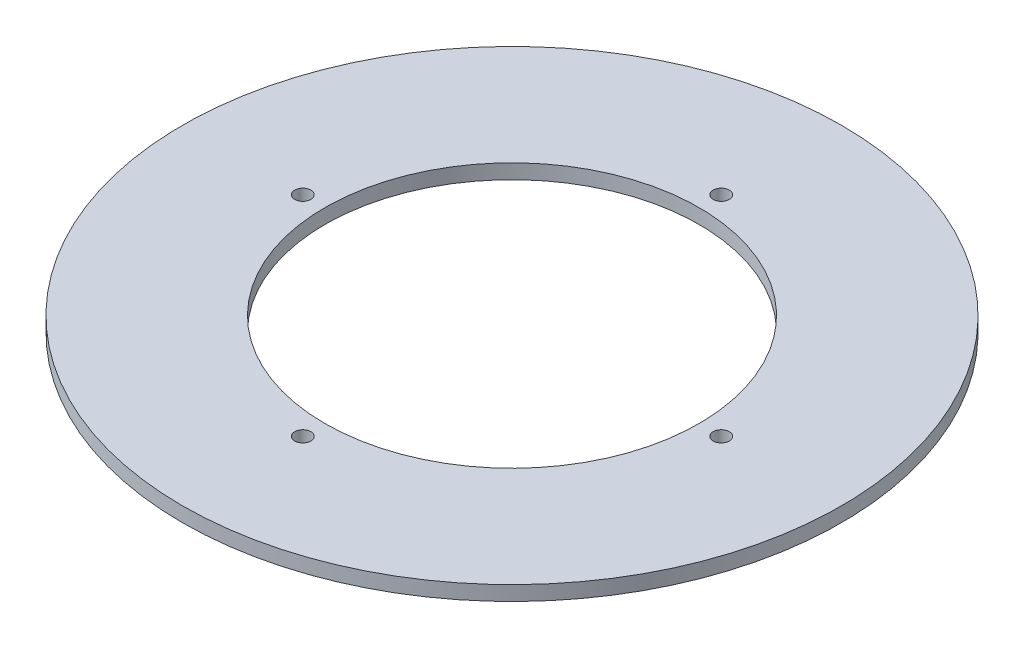
ISO-10303-21;
HEADER;
FILE_DESCRIPTION(('STEP AP214'),'2;1');
FILE_NAME('part.step','',(''),(''),'','','');
FILE_SCHEMA(('AUTOMOTIVE_DESIGN { 1 0 10303 214 1 1 1 1 }'));
ENDSEC;
DATA;
#1=APPLICATION_CONTEXT('core data for automotive mechanical design processes');
#2=APPLICATION_PROTOCOL_DEFINITION('international standard','automotive_design',2000,#1);
#3=PRODUCT_CONTEXT('',#1,'mechanical');
#4=PRODUCT('Part','Part','',(#3));
#5=PRODUCT_RELATED_PRODUCT_CATEGORY('part','',(#4));
#6=PRODUCT_DEFINITION_FORMATION('','',#4);
#7=PRODUCT_DEFINITION_CONTEXT('part definition',#1,'design');
#8=PRODUCT_DEFINITION('design','',#6,#7);
#9=PRODUCT_DEFINITION_SHAPE('','',#8);
#10=(LENGTH_UNIT() NAMED_UNIT(*) SI_UNIT(.MILLI.,.METRE.));
#11=(NAMED_UNIT(*) PLANE_ANGLE_UNIT() SI_UNIT($,.RADIAN.));
#12=(NAMED_UNIT(*) SI_UNIT($,.STERADIAN.) SOLID_ANGLE_UNIT());
#13=UNCERTAINTY_MEASURE_WITH_UNIT(LENGTH_MEASURE(1.E-05),#10,'distance_accuracy_value','');
#14=(GEOMETRIC_REPRESENTATION_CONTEXT(3) GLOBAL_UNCERTAINTY_ASSIGNED_CONTEXT((#13)) GLOBAL_UNIT_ASSIGNED_CONTEXT((#10,
#11,#12)) REPRESENTATION_CONTEXT('',''));
#15=CARTESIAN_POINT('',(0.,0.,0.));
#16=DIRECTION('',(0.,0.,1.));
#17=DIRECTION('',(1.,0.,0.));
#18=AXIS2_PLACEMENT_3D('',#15,#16,#17);
#19=CARTESIAN_POINT('',(0.,4.06,0.));
#20=DIRECTION('',(0.,1.,0.));
#21=DIRECTION('',(0.,0.,1.));
#22=AXIS2_PLACEMENT_3D('',#19,#20,#21);
#23=PLANE('',#22);
#24=CARTESIAN_POINT('',(58.,4.06,0.));
#25=DIRECTION('',(0.,1.,0.));
#26=DIRECTION('',(0.,0.,1.));
#27=AXIS2_PLACEMENT_3D('',#24,#25,#26);
#28=CIRCLE('',#27,2.25);
#29=CARTESIAN_POINT('',(58.,4.06,2.25000000000002));
#30=VERTEX_POINT('',#29);
#31=EDGE_CURVE('E69',#30,#30,#28,.T.);
#32=ORIENTED_EDGE('',*,*,#31,.F.);
#33=EDGE_LOOP('',(#32));
#34=FACE_BOUND('',#33,.T.);
#35=CARTESIAN_POINT('',(-58.,4.06,0.));
#36=DIRECTION('',(0.,1.,0.));
#37=DIRECTION('',(0.,0.,1.));
#38=AXIS2_PLACEMENT_3D('',#35,#36,#37);
#39=CIRCLE('',#38,2.25);
#40=CARTESIAN_POINT('',(-58.,4.06,2.25000000000002));
#41=VERTEX_POINT('',#40);
#42=EDGE_CURVE('E57',#41,#41,#39,.T.);
#43=ORIENTED_EDGE('',*,*,#42,.F.);
#44=EDGE_LOOP('',(#43));
#45=FACE_BOUND('',#44,.T.);
#46=CARTESIAN_POINT('',(0.,4.06,0.));
#47=DIRECTION('',(0.,1.,0.));
#48=DIRECTION('',(0.,0.,1.));
#49=AXIS2_PLACEMENT_3D('',#46,#47,#48);
#50=CIRCLE('',#49,91.36);
#51=CARTESIAN_POINT('',(0.,4.06,91.36));
#52=VERTEX_POINT('',#51);
#53=EDGE_CURVE('E12',#52,#52,#50,.T.);
#54=ORIENTED_EDGE('',*,*,#53,.T.);
#55=EDGE_LOOP('',(#54));
#56=FACE_BOUND('',#55,.T.);
#57=CARTESIAN_POINT('',(0.,4.06,0.));
#58=DIRECTION('',(0.,1.,0.));
#59=DIRECTION('',(0.,0.,1.));
#60=AXIS2_PLACEMENT_3D('',#57,#58,#59);
#61=CIRCLE('',#60,51.86);
#62=CARTESIAN_POINT('',(0.,4.06,51.86));
#63=VERTEX_POINT('',#62);
#64=EDGE_CURVE('E52',#63,#63,#61,.T.);
#65=ORIENTED_EDGE('',*,*,#64,.F.);
#66=EDGE_LOOP('',(#65));
#67=FACE_BOUND('',#66,.T.);
#68=CARTESIAN_POINT('',(0.,4.06,-58.));
#69=DIRECTION('',(0.,1.,0.));
#70=DIRECTION('',(0.,0.,1.));
#71=AXIS2_PLACEMENT_3D('',#68,#69,#70);
#72=CIRCLE('',#71,2.25);
#73=CARTESIAN_POINT('',(0.,4.06,-55.75));
#74=VERTEX_POINT('',#73);
#75=EDGE_CURVE('E63',#74,#74,#72,.T.);
#76=ORIENTED_EDGE('',*,*,#75,.F.);
#77=EDGE_LOOP('',(#76));
#78=FACE_BOUND('',#77,.T.);
#79=CARTESIAN_POINT('',(0.,4.06,58.));
#80=DIRECTION('',(0.,1.,0.));
#81=DIRECTION('',(0.,0.,1.));
#82=AXIS2_PLACEMENT_3D('',#79,#80,#81);
#83=CIRCLE('',#82,2.25);
#84=CARTESIAN_POINT('',(0.,4.06,60.25));
#85=VERTEX_POINT('',#84);
#86=EDGE_CURVE('E75',#85,#85,#83,.T.);
#87=ORIENTED_EDGE('',*,*,#86,.F.);
#88=EDGE_LOOP('',(#87));
#89=FACE_BOUND('',#88,.T.);
#90=ADVANCED_FACE('F41',(#34,#45,#56,#67,#78,#89),#23,.T.);
#91=CARTESIAN_POINT('',(0.,0.,0.));
#92=DIRECTION('',(0.,1.,0.));
#93=DIRECTION('',(0.,0.,1.));
#94=AXIS2_PLACEMENT_3D('',#91,#92,#93);
#95=PLANE('',#94);
#96=CARTESIAN_POINT('',(0.,0.,0.));
#97=DIRECTION('',(0.,1.,0.));
#98=DIRECTION('',(0.,0.,1.));
#99=AXIS2_PLACEMENT_3D('',#96,#97,#98);
#100=CIRCLE('',#99,91.36);
#101=CARTESIAN_POINT('',(0.,0.,91.36));
#102=VERTEX_POINT('',#101);
#103=EDGE_CURVE('E45',#102,#102,#100,.T.);
#104=ORIENTED_EDGE('',*,*,#103,.F.);
#105=EDGE_LOOP('',(#104));
#106=FACE_BOUND('',#105,.T.);
#107=CARTESIAN_POINT('',(0.,0.,0.));
#108=DIRECTION('',(0.,1.,0.));
#109=DIRECTION('',(0.,0.,1.));
#110=AXIS2_PLACEMENT_3D('',#107,#108,#109);
#111=CIRCLE('',#110,51.86);
#112=CARTESIAN_POINT('',(0.,0.,51.86));
#113=VERTEX_POINT('',#112);
#114=EDGE_CURVE('E54',#113,#113,#111,.T.);
#115=ORIENTED_EDGE('',*,*,#114,.T.);
#116=EDGE_LOOP('',(#115));
#117=FACE_BOUND('',#116,.T.);
#118=CARTESIAN_POINT('',(-58.,0.,0.));
#119=DIRECTION('',(0.,1.,0.));
#120=DIRECTION('',(0.,0.,1.));
#121=AXIS2_PLACEMENT_3D('',#118,#119,#120);
#122=CIRCLE('',#121,2.25);
#123=CARTESIAN_POINT('',(-58.,0.,2.25000000000002));
#124=VERTEX_POINT('',#123);
#125=EDGE_CURVE('E60',#124,#124,#122,.T.);
#126=ORIENTED_EDGE('',*,*,#125,.T.);
#127=EDGE_LOOP('',(#126));
#128=FACE_BOUND('',#127,.T.);
#129=CARTESIAN_POINT('',(0.,0.,-58.));
#130=DIRECTION('',(0.,1.,0.));
#131=DIRECTION('',(0.,0.,1.));
#132=AXIS2_PLACEMENT_3D('',#129,#130,#131);
#133=CIRCLE('',#132,2.25);
#134=CARTESIAN_POINT('',(0.,0.,-55.75));
#135=VERTEX_POINT('',#134);
#136=EDGE_CURVE('E66',#135,#135,#133,.T.);
#137=ORIENTED_EDGE('',*,*,#136,.T.);
#138=EDGE_LOOP('',(#137));
#139=FACE_BOUND('',#138,.T.);
#140=CARTESIAN_POINT('',(58.,0.,0.));
#141=DIRECTION('',(0.,1.,0.));
#142=DIRECTION('',(0.,0.,1.));
#143=AXIS2_PLACEMENT_3D('',#140,#141,#142);
#144=CIRCLE('',#143,2.25);
#145=CARTESIAN_POINT('',(58.,0.,2.25000000000002));
#146=VERTEX_POINT('',#145);
#147=EDGE_CURVE('E72',#146,#146,#144,.T.);
#148=ORIENTED_EDGE('',*,*,#147,.T.);
#149=EDGE_LOOP('',(#148));
#150=FACE_BOUND('',#149,.T.);
#151=CARTESIAN_POINT('',(0.,0.,58.));
#152=DIRECTION('',(0.,1.,0.));
#153=DIRECTION('',(0.,0.,1.));
#154=AXIS2_PLACEMENT_3D('',#151,#152,#153);
#155=CIRCLE('',#154,2.25);
#156=CARTESIAN_POINT('',(0.,0.,60.25));
#157=VERTEX_POINT('',#156);
#158=EDGE_CURVE('E78',#157,#157,#155,.T.);
#159=ORIENTED_EDGE('',*,*,#158,.T.);
#160=EDGE_LOOP('',(#159));
#161=FACE_BOUND('',#160,.T.);
#162=ADVANCED_FACE('F88',(#106,#117,#128,#139,#150,#161),#95,.F.);
#163=CARTESIAN_POINT('',(0.,4.06,0.));
#164=DIRECTION('',(0.,-1.,0.));
#165=DIRECTION('',(0.,0.,-1.));
#166=AXIS2_PLACEMENT_3D('',#163,#164,#165);
#167=CYLINDRICAL_SURFACE('',#166,91.36);
#168=ORIENTED_EDGE('',*,*,#53,.F.);
#169=EDGE_LOOP('',(#168));
#170=FACE_BOUND('',#169,.T.);
#171=ORIENTED_EDGE('',*,*,#103,.T.);
#172=EDGE_LOOP('',(#171));
#173=FACE_BOUND('',#172,.T.);
#174=ADVANCED_FACE('F43',(#170,#173),#167,.T.);
#175=CARTESIAN_POINT('',(0.,4.06,0.));
#176=DIRECTION('',(0.,-1.,0.));
#177=DIRECTION('',(0.,0.,-1.));
#178=AXIS2_PLACEMENT_3D('',#175,#176,#177);
#179=CYLINDRICAL_SURFACE('',#178,51.86);
#180=ORIENTED_EDGE('',*,*,#64,.T.);
#181=EDGE_LOOP('',(#180));
#182=FACE_BOUND('',#181,.T.);
#183=ORIENTED_EDGE('',*,*,#114,.F.);
#184=EDGE_LOOP('',(#183));
#185=FACE_BOUND('',#184,.T.);
#186=ADVANCED_FACE('F98',(#182,#185),#179,.F.);
#187=CARTESIAN_POINT('',(-58.,4.06,0.));
#188=DIRECTION('',(0.,-1.,0.));
#189=DIRECTION('',(0.,0.,-1.));
#190=AXIS2_PLACEMENT_3D('',#187,#188,#189);
#191=CYLINDRICAL_SURFACE('',#190,2.25);
#192=ORIENTED_EDGE('',*,*,#42,.T.);
#193=EDGE_LOOP('',(#192));
#194=FACE_BOUND('',#193,.T.);
#195=ORIENTED_EDGE('',*,*,#125,.F.);
#196=EDGE_LOOP('',(#195));
#197=FACE_BOUND('',#196,.T.);
#198=ADVANCED_FACE('F101',(#194,#197),#191,.F.);
#199=CARTESIAN_POINT('',(0.,4.06,-58.));
#200=DIRECTION('',(0.,-1.,0.));
#201=DIRECTION('',(0.,0.,-1.));
#202=AXIS2_PLACEMENT_3D('',#199,#200,#201);
#203=CYLINDRICAL_SURFACE('',#202,2.25);
#204=ORIENTED_EDGE('',*,*,#75,.T.);
#205=EDGE_LOOP('',(#204));
#206=FACE_BOUND('',#205,.T.);
#207=ORIENTED_EDGE('',*,*,#136,.F.);
#208=EDGE_LOOP('',(#207));
#209=FACE_BOUND('',#208,.T.);
#210=ADVANCED_FACE('F105',(#206,#209),#203,.F.);
#211=CARTESIAN_POINT('',(58.,4.06,0.));
#212=DIRECTION('',(0.,-1.,0.));
#213=DIRECTION('',(0.,0.,-1.));
#214=AXIS2_PLACEMENT_3D('',#211,#212,#213);
#215=CYLINDRICAL_SURFACE('',#214,2.25);
#216=ORIENTED_EDGE('',*,*,#31,.T.);
#217=EDGE_LOOP('',(#216));
#218=FACE_BOUND('',#217,.T.);
#219=ORIENTED_EDGE('',*,*,#147,.F.);
#220=EDGE_LOOP('',(#219));
#221=FACE_BOUND('',#220,.T.);
#222=ADVANCED_FACE('F109',(#218,#221),#215,.F.);
#223=CARTESIAN_POINT('',(0.,4.06,58.));
#224=DIRECTION('',(0.,-1.,0.));
#225=DIRECTION('',(0.,0.,-1.));
#226=AXIS2_PLACEMENT_3D('',#223,#224,#225);
#227=CYLINDRICAL_SURFACE('',#226,2.25);
#228=ORIENTED_EDGE('',*,*,#86,.T.);
#229=EDGE_LOOP('',(#228));
#230=FACE_BOUND('',#229,.T.);
#231=ORIENTED_EDGE('',*,*,#158,.F.);
#232=EDGE_LOOP('',(#231));
#233=FACE_BOUND('',#232,.T.);
#234=ADVANCED_FACE('F84',(#230,#233),#227,.F.);
#235=CLOSED_SHELL('',(#90,#162,#174,#186,#198,#210,#222,#234));
#236=MANIFOLD_SOLID_BREP('B2',#235);
#237=ADVANCED_BREP_SHAPE_REPRESENTATION('',(#18,#236),#14);
#238=SHAPE_DEFINITION_REPRESENTATION(#9,#237);
ENDSEC;
END-ISO-10303-21;
